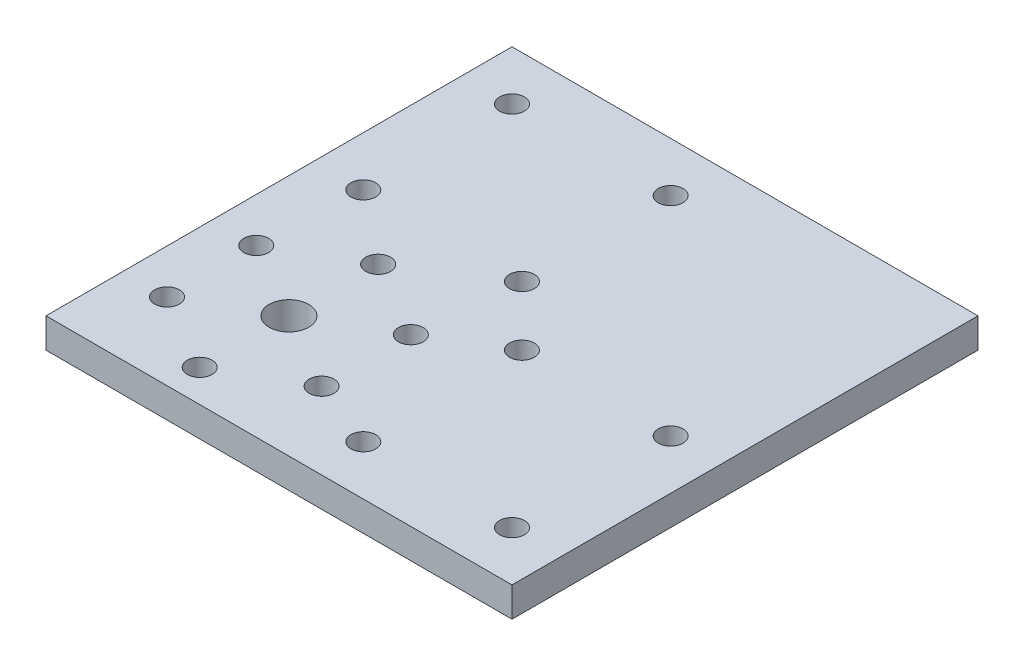
ISO-10303-21;
HEADER;
FILE_DESCRIPTION(('STEP AP214'),'2;1');
FILE_NAME('part.step','',(''),(''),'','','');
FILE_SCHEMA(('AUTOMOTIVE_DESIGN { 1 0 10303 214 1 1 1 1 }'));
ENDSEC;
DATA;
#1=APPLICATION_CONTEXT('core data for automotive mechanical design processes');
#2=APPLICATION_PROTOCOL_DEFINITION('international standard','automotive_design',2000,#1);
#3=PRODUCT_CONTEXT('',#1,'mechanical');
#4=PRODUCT('Part','Part','',(#3));
#5=PRODUCT_RELATED_PRODUCT_CATEGORY('part','',(#4));
#6=PRODUCT_DEFINITION_FORMATION('','',#4);
#7=PRODUCT_DEFINITION_CONTEXT('part definition',#1,'design');
#8=PRODUCT_DEFINITION('design','',#6,#7);
#9=PRODUCT_DEFINITION_SHAPE('','',#8);
#10=(LENGTH_UNIT() NAMED_UNIT(*) SI_UNIT(.MILLI.,.METRE.));
#11=(NAMED_UNIT(*) PLANE_ANGLE_UNIT() SI_UNIT($,.RADIAN.));
#12=(NAMED_UNIT(*) SI_UNIT($,.STERADIAN.) SOLID_ANGLE_UNIT());
#13=UNCERTAINTY_MEASURE_WITH_UNIT(LENGTH_MEASURE(1.E-05),#10,'distance_accuracy_value','');
#14=(GEOMETRIC_REPRESENTATION_CONTEXT(3) GLOBAL_UNCERTAINTY_ASSIGNED_CONTEXT((#13)) GLOBAL_UNIT_ASSIGNED_CONTEXT((#10,
#11,#12)) REPRESENTATION_CONTEXT('',''));
#15=CARTESIAN_POINT('',(0.,0.,0.));
#16=DIRECTION('',(0.,0.,1.));
#17=DIRECTION('',(1.,0.,0.));
#18=AXIS2_PLACEMENT_3D('',#15,#16,#17);
#19=CARTESIAN_POINT('',(-13.,3.,34.5));
#20=DIRECTION('',(1.,0.,0.));
#21=DIRECTION('',(0.,0.,-1.));
#22=AXIS2_PLACEMENT_3D('',#19,#20,#21);
#23=PLANE('',#22);
#24=DIRECTION('',(0.,0.,1.));
#25=VECTOR('',#24,1.);
#26=CARTESIAN_POINT('',(-13.,0.,34.5));
#27=LINE('',#26,#25);
#28=CARTESIAN_POINT('',(-13.,0.,-12.5));
#29=VERTEX_POINT('',#28);
#30=CARTESIAN_POINT('',(-13.,0.,34.5));
#31=VERTEX_POINT('',#30);
#32=EDGE_CURVE('E107',#29,#31,#27,.T.);
#33=ORIENTED_EDGE('',*,*,#32,.T.);
#34=DIRECTION('',(0.,-1.,0.));
#35=VECTOR('',#34,1.);
#36=CARTESIAN_POINT('',(-13.,3.,34.5));
#37=LINE('',#36,#35);
#38=CARTESIAN_POINT('',(-13.,3.,34.5));
#39=VERTEX_POINT('',#38);
#40=EDGE_CURVE('E11',#39,#31,#37,.T.);
#41=ORIENTED_EDGE('',*,*,#40,.F.);
#42=DIRECTION('',(0.,0.,1.));
#43=VECTOR('',#42,1.);
#44=CARTESIAN_POINT('',(-13.,3.,34.5));
#45=LINE('',#44,#43);
#46=CARTESIAN_POINT('',(-13.,3.,-12.5));
#47=VERTEX_POINT('',#46);
#48=EDGE_CURVE('E91',#47,#39,#45,.T.);
#49=ORIENTED_EDGE('',*,*,#48,.F.);
#50=DIRECTION('',(0.,-1.,0.));
#51=VECTOR('',#50,1.);
#52=CARTESIAN_POINT('',(-13.,3.,-12.5));
#53=LINE('',#52,#51);
#54=EDGE_CURVE('E103',#47,#29,#53,.T.);
#55=ORIENTED_EDGE('',*,*,#54,.T.);
#56=EDGE_LOOP('',(#33,#41,#49,#55));
#57=FACE_BOUND('',#56,.T.);
#58=ADVANCED_FACE('F39',(#57),#23,.F.);
#59=CARTESIAN_POINT('',(34.,3.,34.5));
#60=DIRECTION('',(0.,0.,-1.));
#61=DIRECTION('',(-1.,0.,0.));
#62=AXIS2_PLACEMENT_3D('',#59,#60,#61);
#63=PLANE('',#62);
#64=DIRECTION('',(1.,0.,0.));
#65=VECTOR('',#64,1.);
#66=CARTESIAN_POINT('',(34.,0.,34.5));
#67=LINE('',#66,#65);
#68=CARTESIAN_POINT('',(34.,0.,34.5));
#69=VERTEX_POINT('',#68);
#70=EDGE_CURVE('E96',#31,#69,#67,.T.);
#71=ORIENTED_EDGE('',*,*,#70,.T.);
#72=DIRECTION('',(0.,-1.,0.));
#73=VECTOR('',#72,1.);
#74=CARTESIAN_POINT('',(34.,3.,34.5));
#75=LINE('',#74,#73);
#76=CARTESIAN_POINT('',(34.,3.,34.5));
#77=VERTEX_POINT('',#76);
#78=EDGE_CURVE('E48',#77,#69,#75,.T.);
#79=ORIENTED_EDGE('',*,*,#78,.F.);
#80=DIRECTION('',(1.,0.,0.));
#81=VECTOR('',#80,1.);
#82=CARTESIAN_POINT('',(34.,3.,34.5));
#83=LINE('',#82,#81);
#84=EDGE_CURVE('E86',#39,#77,#83,.T.);
#85=ORIENTED_EDGE('',*,*,#84,.F.);
#86=ORIENTED_EDGE('',*,*,#40,.T.);
#87=EDGE_LOOP('',(#71,#79,#85,#86));
#88=FACE_BOUND('',#87,.T.);
#89=ADVANCED_FACE('F95',(#88),#63,.F.);
#90=CARTESIAN_POINT('',(34.,3.,-12.5));
#91=DIRECTION('',(-1.,0.,0.));
#92=DIRECTION('',(0.,0.,1.));
#93=AXIS2_PLACEMENT_3D('',#90,#91,#92);
#94=PLANE('',#93);
#95=DIRECTION('',(0.,0.,-1.));
#96=VECTOR('',#95,1.);
#97=CARTESIAN_POINT('',(34.,0.,-12.5));
#98=LINE('',#97,#96);
#99=CARTESIAN_POINT('',(34.,0.,-12.5));
#100=VERTEX_POINT('',#99);
#101=EDGE_CURVE('E73',#69,#100,#98,.T.);
#102=ORIENTED_EDGE('',*,*,#101,.T.);
#103=DIRECTION('',(0.,-1.,0.));
#104=VECTOR('',#103,1.);
#105=CARTESIAN_POINT('',(34.,3.,-12.5));
#106=LINE('',#105,#104);
#107=CARTESIAN_POINT('',(34.,3.,-12.5));
#108=VERTEX_POINT('',#107);
#109=EDGE_CURVE('E98',#108,#100,#106,.T.);
#110=ORIENTED_EDGE('',*,*,#109,.F.);
#111=DIRECTION('',(0.,0.,-1.));
#112=VECTOR('',#111,1.);
#113=CARTESIAN_POINT('',(34.,3.,-12.5));
#114=LINE('',#113,#112);
#115=EDGE_CURVE('E89',#77,#108,#114,.T.);
#116=ORIENTED_EDGE('',*,*,#115,.F.);
#117=ORIENTED_EDGE('',*,*,#78,.T.);
#118=EDGE_LOOP('',(#102,#110,#116,#117));
#119=FACE_BOUND('',#118,.T.);
#120=ADVANCED_FACE('F99',(#119),#94,.F.);
#121=CARTESIAN_POINT('',(-13.,3.,-12.5));
#122=DIRECTION('',(0.,0.,1.));
#123=DIRECTION('',(1.,0.,0.));
#124=AXIS2_PLACEMENT_3D('',#121,#122,#123);
#125=PLANE('',#124);
#126=DIRECTION('',(-1.,0.,0.));
#127=VECTOR('',#126,1.);
#128=CARTESIAN_POINT('',(-13.,0.,-12.5));
#129=LINE('',#128,#127);
#130=EDGE_CURVE('E79',#100,#29,#129,.T.);
#131=ORIENTED_EDGE('',*,*,#130,.T.);
#132=ORIENTED_EDGE('',*,*,#54,.F.);
#133=DIRECTION('',(-1.,0.,0.));
#134=VECTOR('',#133,1.);
#135=CARTESIAN_POINT('',(-13.,3.,-12.5));
#136=LINE('',#135,#134);
#137=EDGE_CURVE('E56',#108,#47,#136,.T.);
#138=ORIENTED_EDGE('',*,*,#137,.F.);
#139=ORIENTED_EDGE('',*,*,#109,.T.);
#140=EDGE_LOOP('',(#131,#132,#138,#139));
#141=FACE_BOUND('',#140,.T.);
#142=ADVANCED_FACE('F121',(#141),#125,.F.);
#143=CARTESIAN_POINT('',(0.,3.,0.));
#144=DIRECTION('',(0.,-1.,0.));
#145=DIRECTION('',(0.,0.,-1.));
#146=AXIS2_PLACEMENT_3D('',#143,#144,#145);
#147=PLANE('',#146);
#148=CARTESIAN_POINT('',(-0.749999999999989,3.,22.25));
#149=DIRECTION('',(0.,1.,0.));
#150=DIRECTION('',(0.,0.,1.));
#151=AXIS2_PLACEMENT_3D('',#148,#149,#150);
#152=CIRCLE('',#151,2.);
#153=CARTESIAN_POINT('',(-0.749999999999989,3.,24.25));
#154=VERTEX_POINT('',#153);
#155=EDGE_CURVE('E243',#154,#154,#152,.T.);
#156=ORIENTED_EDGE('',*,*,#155,.F.);
#157=EDGE_LOOP('',(#156));
#158=FACE_BOUND('',#157,.T.);
#159=CARTESIAN_POINT('',(-0.749999999999988,3.,13.25));
#160=DIRECTION('',(0.,1.,0.));
#161=DIRECTION('',(0.,0.,1.));
#162=AXIS2_PLACEMENT_3D('',#159,#160,#161);
#163=CIRCLE('',#162,1.24999999999999);
#164=CARTESIAN_POINT('',(-0.749999999999988,3.,14.5));
#165=VERTEX_POINT('',#164);
#166=EDGE_CURVE('E235',#165,#165,#163,.T.);
#167=ORIENTED_EDGE('',*,*,#166,.F.);
#168=EDGE_LOOP('',(#167));
#169=FACE_BOUND('',#168,.T.);
#170=CARTESIAN_POINT('',(-8.54422863405994,3.,17.75));
#171=DIRECTION('',(0.,1.,0.));
#172=DIRECTION('',(0.,0.,1.));
#173=AXIS2_PLACEMENT_3D('',#170,#171,#172);
#174=CIRCLE('',#173,1.24999999999999);
#175=CARTESIAN_POINT('',(-8.54422863405994,3.,19.));
#176=VERTEX_POINT('',#175);
#177=EDGE_CURVE('E227',#176,#176,#174,.T.);
#178=ORIENTED_EDGE('',*,*,#177,.F.);
#179=EDGE_LOOP('',(#178));
#180=FACE_BOUND('',#179,.T.);
#181=CARTESIAN_POINT('',(-8.54422863405993,3.,26.75));
#182=DIRECTION('',(0.,1.,0.));
#183=DIRECTION('',(0.,0.,1.));
#184=AXIS2_PLACEMENT_3D('',#181,#182,#183);
#185=CIRCLE('',#184,1.24999999999999);
#186=CARTESIAN_POINT('',(-8.54422863405993,3.,28.));
#187=VERTEX_POINT('',#186);
#188=EDGE_CURVE('E219',#187,#187,#185,.T.);
#189=ORIENTED_EDGE('',*,*,#188,.F.);
#190=EDGE_LOOP('',(#189));
#191=FACE_BOUND('',#190,.T.);
#192=CARTESIAN_POINT('',(-0.749999999999987,3.,31.25));
#193=DIRECTION('',(0.,1.,0.));
#194=DIRECTION('',(0.,0.,1.));
#195=AXIS2_PLACEMENT_3D('',#192,#193,#194);
#196=CIRCLE('',#195,1.24999999999999);
#197=CARTESIAN_POINT('',(-0.749999999999987,3.,32.5));
#198=VERTEX_POINT('',#197);
#199=EDGE_CURVE('E211',#198,#198,#196,.T.);
#200=ORIENTED_EDGE('',*,*,#199,.F.);
#201=EDGE_LOOP('',(#200));
#202=FACE_BOUND('',#201,.T.);
#203=CARTESIAN_POINT('',(7.04422863405996,3.,26.75));
#204=DIRECTION('',(0.,1.,0.));
#205=DIRECTION('',(0.,0.,1.));
#206=AXIS2_PLACEMENT_3D('',#203,#204,#205);
#207=CIRCLE('',#206,1.24999999999999);
#208=CARTESIAN_POINT('',(7.04422863405996,3.,28.));
#209=VERTEX_POINT('',#208);
#210=EDGE_CURVE('E203',#209,#209,#207,.T.);
#211=ORIENTED_EDGE('',*,*,#210,.F.);
#212=EDGE_LOOP('',(#211));
#213=FACE_BOUND('',#212,.T.);
#214=CARTESIAN_POINT('',(7.04422863405996,3.,17.75));
#215=DIRECTION('',(0.,1.,0.));
#216=DIRECTION('',(0.,0.,1.));
#217=AXIS2_PLACEMENT_3D('',#214,#215,#216);
#218=CIRCLE('',#217,1.24999999999999);
#219=CARTESIAN_POINT('',(7.04422863405996,3.,19.));
#220=VERTEX_POINT('',#219);
#221=EDGE_CURVE('E195',#220,#220,#218,.T.);
#222=ORIENTED_EDGE('',*,*,#221,.F.);
#223=EDGE_LOOP('',(#222));
#224=FACE_BOUND('',#223,.T.);
#225=CARTESIAN_POINT('',(-8.,3.,-7.5));
#226=DIRECTION('',(0.,1.,0.));
#227=DIRECTION('',(0.,0.,1.));
#228=AXIS2_PLACEMENT_3D('',#225,#226,#227);
#229=CIRCLE('',#228,1.24999999999999);
#230=CARTESIAN_POINT('',(-8.,3.,-6.25000000000001));
#231=VERTEX_POINT('',#230);
#232=EDGE_CURVE('E187',#231,#231,#229,.T.);
#233=ORIENTED_EDGE('',*,*,#232,.F.);
#234=EDGE_LOOP('',(#233));
#235=FACE_BOUND('',#234,.T.);
#236=CARTESIAN_POINT('',(8.,3.,-7.5));
#237=DIRECTION('',(0.,1.,0.));
#238=DIRECTION('',(0.,0.,1.));
#239=AXIS2_PLACEMENT_3D('',#236,#237,#238);
#240=CIRCLE('',#239,1.24999999999999);
#241=CARTESIAN_POINT('',(8.,3.,-6.25000000000001));
#242=VERTEX_POINT('',#241);
#243=EDGE_CURVE('E179',#242,#242,#240,.T.);
#244=ORIENTED_EDGE('',*,*,#243,.F.);
#245=EDGE_LOOP('',(#244));
#246=FACE_BOUND('',#245,.T.);
#247=CARTESIAN_POINT('',(8.,3.,7.5));
#248=DIRECTION('',(0.,1.,0.));
#249=DIRECTION('',(0.,0.,1.));
#250=AXIS2_PLACEMENT_3D('',#247,#248,#249);
#251=CIRCLE('',#250,1.24999999999999);
#252=CARTESIAN_POINT('',(8.,3.,8.74999999999999));
#253=VERTEX_POINT('',#252);
#254=EDGE_CURVE('E171',#253,#253,#251,.T.);
#255=ORIENTED_EDGE('',*,*,#254,.F.);
#256=EDGE_LOOP('',(#255));
#257=FACE_BOUND('',#256,.T.);
#258=CARTESIAN_POINT('',(-8.,3.,7.5));
#259=DIRECTION('',(0.,1.,0.));
#260=DIRECTION('',(0.,0.,1.));
#261=AXIS2_PLACEMENT_3D('',#258,#259,#260);
#262=CIRCLE('',#261,1.24999999999999);
#263=CARTESIAN_POINT('',(-8.,3.,8.74999999999999));
#264=VERTEX_POINT('',#263);
#265=EDGE_CURVE('E163',#264,#264,#262,.T.);
#266=ORIENTED_EDGE('',*,*,#265,.F.);
#267=EDGE_LOOP('',(#266));
#268=FACE_BOUND('',#267,.T.);
#269=CARTESIAN_POINT('',(14.,3.,13.5));
#270=DIRECTION('',(0.,1.,0.));
#271=DIRECTION('',(0.,0.,1.));
#272=AXIS2_PLACEMENT_3D('',#269,#270,#271);
#273=CIRCLE('',#272,1.24999999999999);
#274=CARTESIAN_POINT('',(14.,3.,14.75));
#275=VERTEX_POINT('',#274);
#276=EDGE_CURVE('E155',#275,#275,#273,.T.);
#277=ORIENTED_EDGE('',*,*,#276,.F.);
#278=EDGE_LOOP('',(#277));
#279=FACE_BOUND('',#278,.T.);
#280=CARTESIAN_POINT('',(29.,3.,13.5));
#281=DIRECTION('',(0.,1.,0.));
#282=DIRECTION('',(0.,0.,1.));
#283=AXIS2_PLACEMENT_3D('',#280,#281,#282);
#284=CIRCLE('',#283,1.24999999999999);
#285=CARTESIAN_POINT('',(29.,3.,14.75));
#286=VERTEX_POINT('',#285);
#287=EDGE_CURVE('E147',#286,#286,#284,.T.);
#288=ORIENTED_EDGE('',*,*,#287,.F.);
#289=EDGE_LOOP('',(#288));
#290=FACE_BOUND('',#289,.T.);
#291=CARTESIAN_POINT('',(29.,3.,29.5));
#292=DIRECTION('',(0.,1.,0.));
#293=DIRECTION('',(0.,0.,1.));
#294=AXIS2_PLACEMENT_3D('',#291,#292,#293);
#295=CIRCLE('',#294,1.24999999999999);
#296=CARTESIAN_POINT('',(29.,3.,30.75));
#297=VERTEX_POINT('',#296);
#298=EDGE_CURVE('E139',#297,#297,#295,.T.);
#299=ORIENTED_EDGE('',*,*,#298,.F.);
#300=EDGE_LOOP('',(#299));
#301=FACE_BOUND('',#300,.T.);
#302=CARTESIAN_POINT('',(14.,3.,29.5));
#303=DIRECTION('',(0.,1.,0.));
#304=DIRECTION('',(0.,0.,1.));
#305=AXIS2_PLACEMENT_3D('',#302,#303,#304);
#306=CIRCLE('',#305,1.24999999999999);
#307=CARTESIAN_POINT('',(14.,3.,30.75));
#308=VERTEX_POINT('',#307);
#309=EDGE_CURVE('E131',#308,#308,#306,.T.);
#310=ORIENTED_EDGE('',*,*,#309,.F.);
#311=EDGE_LOOP('',(#310));
#312=FACE_BOUND('',#311,.T.);
#313=ORIENTED_EDGE('',*,*,#48,.T.);
#314=ORIENTED_EDGE('',*,*,#84,.T.);
#315=ORIENTED_EDGE('',*,*,#115,.T.);
#316=ORIENTED_EDGE('',*,*,#137,.T.);
#317=EDGE_LOOP('',(#313,#314,#315,#316));
#318=FACE_BOUND('',#317,.T.);
#319=ADVANCED_FACE('F87',(#158,#169,#180,#191,#202,#213,#224,#235,#246,#257,#268,#279,#290,#301,
#312,#318),#147,.F.);
#320=CARTESIAN_POINT('',(0.,0.,0.));
#321=DIRECTION('',(0.,-1.,0.));
#322=DIRECTION('',(0.,0.,-1.));
#323=AXIS2_PLACEMENT_3D('',#320,#321,#322);
#324=PLANE('',#323);
#325=CARTESIAN_POINT('',(-0.749999999999989,0.,22.25));
#326=DIRECTION('',(0.,1.,0.));
#327=DIRECTION('',(0.,0.,1.));
#328=AXIS2_PLACEMENT_3D('',#325,#326,#327);
#329=CIRCLE('',#328,2.);
#330=CARTESIAN_POINT('',(-0.749999999999989,0.,24.25));
#331=VERTEX_POINT('',#330);
#332=EDGE_CURVE('E239',#331,#331,#329,.T.);
#333=ORIENTED_EDGE('',*,*,#332,.T.);
#334=EDGE_LOOP('',(#333));
#335=FACE_BOUND('',#334,.T.);
#336=CARTESIAN_POINT('',(-0.749999999999988,0.,13.25));
#337=DIRECTION('',(0.,1.,0.));
#338=DIRECTION('',(0.,0.,1.));
#339=AXIS2_PLACEMENT_3D('',#336,#337,#338);
#340=CIRCLE('',#339,1.25);
#341=CARTESIAN_POINT('',(-0.749999999999988,0.,14.5));
#342=VERTEX_POINT('',#341);
#343=EDGE_CURVE('E231',#342,#342,#340,.T.);
#344=ORIENTED_EDGE('',*,*,#343,.T.);
#345=EDGE_LOOP('',(#344));
#346=FACE_BOUND('',#345,.T.);
#347=CARTESIAN_POINT('',(-8.54422863405994,0.,17.75));
#348=DIRECTION('',(0.,1.,0.));
#349=DIRECTION('',(0.,0.,1.));
#350=AXIS2_PLACEMENT_3D('',#347,#348,#349);
#351=CIRCLE('',#350,1.25);
#352=CARTESIAN_POINT('',(-8.54422863405994,0.,19.));
#353=VERTEX_POINT('',#352);
#354=EDGE_CURVE('E223',#353,#353,#351,.T.);
#355=ORIENTED_EDGE('',*,*,#354,.T.);
#356=EDGE_LOOP('',(#355));
#357=FACE_BOUND('',#356,.T.);
#358=CARTESIAN_POINT('',(-8.54422863405993,0.,26.75));
#359=DIRECTION('',(0.,1.,0.));
#360=DIRECTION('',(0.,0.,1.));
#361=AXIS2_PLACEMENT_3D('',#358,#359,#360);
#362=CIRCLE('',#361,1.25);
#363=CARTESIAN_POINT('',(-8.54422863405993,0.,28.));
#364=VERTEX_POINT('',#363);
#365=EDGE_CURVE('E215',#364,#364,#362,.T.);
#366=ORIENTED_EDGE('',*,*,#365,.T.);
#367=EDGE_LOOP('',(#366));
#368=FACE_BOUND('',#367,.T.);
#369=CARTESIAN_POINT('',(-0.749999999999987,0.,31.25));
#370=DIRECTION('',(0.,1.,0.));
#371=DIRECTION('',(0.,0.,1.));
#372=AXIS2_PLACEMENT_3D('',#369,#370,#371);
#373=CIRCLE('',#372,1.25);
#374=CARTESIAN_POINT('',(-0.749999999999987,0.,32.5));
#375=VERTEX_POINT('',#374);
#376=EDGE_CURVE('E207',#375,#375,#373,.T.);
#377=ORIENTED_EDGE('',*,*,#376,.T.);
#378=EDGE_LOOP('',(#377));
#379=FACE_BOUND('',#378,.T.);
#380=CARTESIAN_POINT('',(7.04422863405996,0.,26.75));
#381=DIRECTION('',(0.,1.,0.));
#382=DIRECTION('',(0.,0.,1.));
#383=AXIS2_PLACEMENT_3D('',#380,#381,#382);
#384=CIRCLE('',#383,1.25);
#385=CARTESIAN_POINT('',(7.04422863405996,0.,28.));
#386=VERTEX_POINT('',#385);
#387=EDGE_CURVE('E199',#386,#386,#384,.T.);
#388=ORIENTED_EDGE('',*,*,#387,.T.);
#389=EDGE_LOOP('',(#388));
#390=FACE_BOUND('',#389,.T.);
#391=CARTESIAN_POINT('',(7.04422863405996,0.,17.75));
#392=DIRECTION('',(0.,1.,0.));
#393=DIRECTION('',(0.,0.,1.));
#394=AXIS2_PLACEMENT_3D('',#391,#392,#393);
#395=CIRCLE('',#394,1.25);
#396=CARTESIAN_POINT('',(7.04422863405996,0.,19.));
#397=VERTEX_POINT('',#396);
#398=EDGE_CURVE('E191',#397,#397,#395,.T.);
#399=ORIENTED_EDGE('',*,*,#398,.T.);
#400=EDGE_LOOP('',(#399));
#401=FACE_BOUND('',#400,.T.);
#402=CARTESIAN_POINT('',(-8.,0.,-7.5));
#403=DIRECTION('',(0.,1.,0.));
#404=DIRECTION('',(0.,0.,1.));
#405=AXIS2_PLACEMENT_3D('',#402,#403,#404);
#406=CIRCLE('',#405,1.25);
#407=CARTESIAN_POINT('',(-8.,0.,-6.25));
#408=VERTEX_POINT('',#407);
#409=EDGE_CURVE('E183',#408,#408,#406,.T.);
#410=ORIENTED_EDGE('',*,*,#409,.T.);
#411=EDGE_LOOP('',(#410));
#412=FACE_BOUND('',#411,.T.);
#413=CARTESIAN_POINT('',(8.,0.,-7.5));
#414=DIRECTION('',(0.,1.,0.));
#415=DIRECTION('',(0.,0.,1.));
#416=AXIS2_PLACEMENT_3D('',#413,#414,#415);
#417=CIRCLE('',#416,1.25);
#418=CARTESIAN_POINT('',(8.,0.,-6.25));
#419=VERTEX_POINT('',#418);
#420=EDGE_CURVE('E175',#419,#419,#417,.T.);
#421=ORIENTED_EDGE('',*,*,#420,.T.);
#422=EDGE_LOOP('',(#421));
#423=FACE_BOUND('',#422,.T.);
#424=CARTESIAN_POINT('',(8.,0.,7.5));
#425=DIRECTION('',(0.,1.,0.));
#426=DIRECTION('',(0.,0.,1.));
#427=AXIS2_PLACEMENT_3D('',#424,#425,#426);
#428=CIRCLE('',#427,1.25);
#429=CARTESIAN_POINT('',(8.,0.,8.75));
#430=VERTEX_POINT('',#429);
#431=EDGE_CURVE('E167',#430,#430,#428,.T.);
#432=ORIENTED_EDGE('',*,*,#431,.T.);
#433=EDGE_LOOP('',(#432));
#434=FACE_BOUND('',#433,.T.);
#435=CARTESIAN_POINT('',(-8.,0.,7.5));
#436=DIRECTION('',(0.,1.,0.));
#437=DIRECTION('',(0.,0.,1.));
#438=AXIS2_PLACEMENT_3D('',#435,#436,#437);
#439=CIRCLE('',#438,1.25);
#440=CARTESIAN_POINT('',(-8.,0.,8.75));
#441=VERTEX_POINT('',#440);
#442=EDGE_CURVE('E159',#441,#441,#439,.T.);
#443=ORIENTED_EDGE('',*,*,#442,.T.);
#444=EDGE_LOOP('',(#443));
#445=FACE_BOUND('',#444,.T.);
#446=CARTESIAN_POINT('',(14.,0.,13.5));
#447=DIRECTION('',(0.,1.,0.));
#448=DIRECTION('',(0.,0.,1.));
#449=AXIS2_PLACEMENT_3D('',#446,#447,#448);
#450=CIRCLE('',#449,1.25);
#451=CARTESIAN_POINT('',(14.,0.,14.75));
#452=VERTEX_POINT('',#451);
#453=EDGE_CURVE('E151',#452,#452,#450,.T.);
#454=ORIENTED_EDGE('',*,*,#453,.T.);
#455=EDGE_LOOP('',(#454));
#456=FACE_BOUND('',#455,.T.);
#457=CARTESIAN_POINT('',(29.,0.,13.5));
#458=DIRECTION('',(0.,1.,0.));
#459=DIRECTION('',(0.,0.,1.));
#460=AXIS2_PLACEMENT_3D('',#457,#458,#459);
#461=CIRCLE('',#460,1.25);
#462=CARTESIAN_POINT('',(29.,0.,14.75));
#463=VERTEX_POINT('',#462);
#464=EDGE_CURVE('E143',#463,#463,#461,.T.);
#465=ORIENTED_EDGE('',*,*,#464,.T.);
#466=EDGE_LOOP('',(#465));
#467=FACE_BOUND('',#466,.T.);
#468=CARTESIAN_POINT('',(29.,0.,29.5));
#469=DIRECTION('',(0.,1.,0.));
#470=DIRECTION('',(0.,0.,1.));
#471=AXIS2_PLACEMENT_3D('',#468,#469,#470);
#472=CIRCLE('',#471,1.25);
#473=CARTESIAN_POINT('',(29.,0.,30.75));
#474=VERTEX_POINT('',#473);
#475=EDGE_CURVE('E135',#474,#474,#472,.T.);
#476=ORIENTED_EDGE('',*,*,#475,.T.);
#477=EDGE_LOOP('',(#476));
#478=FACE_BOUND('',#477,.T.);
#479=CARTESIAN_POINT('',(14.,0.,29.5));
#480=DIRECTION('',(0.,1.,0.));
#481=DIRECTION('',(0.,0.,1.));
#482=AXIS2_PLACEMENT_3D('',#479,#480,#481);
#483=CIRCLE('',#482,1.25);
#484=CARTESIAN_POINT('',(14.,0.,30.75));
#485=VERTEX_POINT('',#484);
#486=EDGE_CURVE('E111',#485,#485,#483,.T.);
#487=ORIENTED_EDGE('',*,*,#486,.T.);
#488=EDGE_LOOP('',(#487));
#489=FACE_BOUND('',#488,.T.);
#490=ORIENTED_EDGE('',*,*,#32,.F.);
#491=ORIENTED_EDGE('',*,*,#130,.F.);
#492=ORIENTED_EDGE('',*,*,#101,.F.);
#493=ORIENTED_EDGE('',*,*,#70,.F.);
#494=EDGE_LOOP('',(#490,#491,#492,#493));
#495=FACE_BOUND('',#494,.T.);
#496=ADVANCED_FACE('F124',(#335,#346,#357,#368,#379,#390,#401,#412,#423,#434,#445,#456,#467,
#478,#489,#495),#324,.T.);
#497=CARTESIAN_POINT('',(14.,3.,29.5));
#498=DIRECTION('',(0.,1.,0.));
#499=DIRECTION('',(0.,0.,1.));
#500=AXIS2_PLACEMENT_3D('',#497,#498,#499);
#501=CYLINDRICAL_SURFACE('',#500,1.24999999999999);
#502=ORIENTED_EDGE('',*,*,#486,.F.);
#503=EDGE_LOOP('',(#502));
#504=FACE_BOUND('',#503,.T.);
#505=ORIENTED_EDGE('',*,*,#309,.T.);
#506=EDGE_LOOP('',(#505));
#507=FACE_BOUND('',#506,.T.);
#508=ADVANCED_FACE('F281',(#504,#507),#501,.F.);
#509=CARTESIAN_POINT('',(29.,3.,29.5));
#510=DIRECTION('',(0.,1.,0.));
#511=DIRECTION('',(0.,0.,1.));
#512=AXIS2_PLACEMENT_3D('',#509,#510,#511);
#513=CYLINDRICAL_SURFACE('',#512,1.24999999999999);
#514=ORIENTED_EDGE('',*,*,#475,.F.);
#515=EDGE_LOOP('',(#514));
#516=FACE_BOUND('',#515,.T.);
#517=ORIENTED_EDGE('',*,*,#298,.T.);
#518=EDGE_LOOP('',(#517));
#519=FACE_BOUND('',#518,.T.);
#520=ADVANCED_FACE('F283',(#516,#519),#513,.F.);
#521=CARTESIAN_POINT('',(29.,3.,13.5));
#522=DIRECTION('',(0.,1.,0.));
#523=DIRECTION('',(0.,0.,1.));
#524=AXIS2_PLACEMENT_3D('',#521,#522,#523);
#525=CYLINDRICAL_SURFACE('',#524,1.24999999999999);
#526=ORIENTED_EDGE('',*,*,#464,.F.);
#527=EDGE_LOOP('',(#526));
#528=FACE_BOUND('',#527,.T.);
#529=ORIENTED_EDGE('',*,*,#287,.T.);
#530=EDGE_LOOP('',(#529));
#531=FACE_BOUND('',#530,.T.);
#532=ADVANCED_FACE('F290',(#528,#531),#525,.F.);
#533=CARTESIAN_POINT('',(14.,3.,13.5));
#534=DIRECTION('',(0.,1.,0.));
#535=DIRECTION('',(0.,0.,1.));
#536=AXIS2_PLACEMENT_3D('',#533,#534,#535);
#537=CYLINDRICAL_SURFACE('',#536,1.24999999999999);
#538=ORIENTED_EDGE('',*,*,#453,.F.);
#539=EDGE_LOOP('',(#538));
#540=FACE_BOUND('',#539,.T.);
#541=ORIENTED_EDGE('',*,*,#276,.T.);
#542=EDGE_LOOP('',(#541));
#543=FACE_BOUND('',#542,.T.);
#544=ADVANCED_FACE('F409',(#540,#543),#537,.F.);
#545=CARTESIAN_POINT('',(-8.,3.,7.5));
#546=DIRECTION('',(0.,1.,0.));
#547=DIRECTION('',(0.,0.,1.));
#548=AXIS2_PLACEMENT_3D('',#545,#546,#547);
#549=CYLINDRICAL_SURFACE('',#548,1.24999999999999);
#550=ORIENTED_EDGE('',*,*,#442,.F.);
#551=EDGE_LOOP('',(#550));
#552=FACE_BOUND('',#551,.T.);
#553=ORIENTED_EDGE('',*,*,#265,.T.);
#554=EDGE_LOOP('',(#553));
#555=FACE_BOUND('',#554,.T.);
#556=ADVANCED_FACE('F401',(#552,#555),#549,.F.);
#557=CARTESIAN_POINT('',(8.,3.,7.5));
#558=DIRECTION('',(0.,1.,0.));
#559=DIRECTION('',(0.,0.,1.));
#560=AXIS2_PLACEMENT_3D('',#557,#558,#559);
#561=CYLINDRICAL_SURFACE('',#560,1.24999999999999);
#562=ORIENTED_EDGE('',*,*,#431,.F.);
#563=EDGE_LOOP('',(#562));
#564=FACE_BOUND('',#563,.T.);
#565=ORIENTED_EDGE('',*,*,#254,.T.);
#566=EDGE_LOOP('',(#565));
#567=FACE_BOUND('',#566,.T.);
#568=ADVANCED_FACE('F393',(#564,#567),#561,.F.);
#569=CARTESIAN_POINT('',(8.,3.,-7.5));
#570=DIRECTION('',(0.,1.,0.));
#571=DIRECTION('',(0.,0.,1.));
#572=AXIS2_PLACEMENT_3D('',#569,#570,#571);
#573=CYLINDRICAL_SURFACE('',#572,1.24999999999999);
#574=ORIENTED_EDGE('',*,*,#420,.F.);
#575=EDGE_LOOP('',(#574));
#576=FACE_BOUND('',#575,.T.);
#577=ORIENTED_EDGE('',*,*,#243,.T.);
#578=EDGE_LOOP('',(#577));
#579=FACE_BOUND('',#578,.T.);
#580=ADVANCED_FACE('F385',(#576,#579),#573,.F.);
#581=CARTESIAN_POINT('',(-8.,3.,-7.5));
#582=DIRECTION('',(0.,1.,0.));
#583=DIRECTION('',(0.,0.,1.));
#584=AXIS2_PLACEMENT_3D('',#581,#582,#583);
#585=CYLINDRICAL_SURFACE('',#584,1.24999999999999);
#586=ORIENTED_EDGE('',*,*,#409,.F.);
#587=EDGE_LOOP('',(#586));
#588=FACE_BOUND('',#587,.T.);
#589=ORIENTED_EDGE('',*,*,#232,.T.);
#590=EDGE_LOOP('',(#589));
#591=FACE_BOUND('',#590,.T.);
#592=ADVANCED_FACE('F377',(#588,#591),#585,.F.);
#593=CARTESIAN_POINT('',(7.04422863405996,3.,17.75));
#594=DIRECTION('',(0.,1.,0.));
#595=DIRECTION('',(0.,0.,1.));
#596=AXIS2_PLACEMENT_3D('',#593,#594,#595);
#597=CYLINDRICAL_SURFACE('',#596,1.24999999999999);
#598=ORIENTED_EDGE('',*,*,#398,.F.);
#599=EDGE_LOOP('',(#598));
#600=FACE_BOUND('',#599,.T.);
#601=ORIENTED_EDGE('',*,*,#221,.T.);
#602=EDGE_LOOP('',(#601));
#603=FACE_BOUND('',#602,.T.);
#604=ADVANCED_FACE('F369',(#600,#603),#597,.F.);
#605=CARTESIAN_POINT('',(7.04422863405996,3.,26.75));
#606=DIRECTION('',(0.,1.,0.));
#607=DIRECTION('',(0.,0.,1.));
#608=AXIS2_PLACEMENT_3D('',#605,#606,#607);
#609=CYLINDRICAL_SURFACE('',#608,1.24999999999999);
#610=ORIENTED_EDGE('',*,*,#387,.F.);
#611=EDGE_LOOP('',(#610));
#612=FACE_BOUND('',#611,.T.);
#613=ORIENTED_EDGE('',*,*,#210,.T.);
#614=EDGE_LOOP('',(#613));
#615=FACE_BOUND('',#614,.T.);
#616=ADVANCED_FACE('F361',(#612,#615),#609,.F.);
#617=CARTESIAN_POINT('',(-0.749999999999987,3.,31.25));
#618=DIRECTION('',(0.,1.,0.));
#619=DIRECTION('',(0.,0.,1.));
#620=AXIS2_PLACEMENT_3D('',#617,#618,#619);
#621=CYLINDRICAL_SURFACE('',#620,1.24999999999999);
#622=ORIENTED_EDGE('',*,*,#376,.F.);
#623=EDGE_LOOP('',(#622));
#624=FACE_BOUND('',#623,.T.);
#625=ORIENTED_EDGE('',*,*,#199,.T.);
#626=EDGE_LOOP('',(#625));
#627=FACE_BOUND('',#626,.T.);
#628=ADVANCED_FACE('F353',(#624,#627),#621,.F.);
#629=CARTESIAN_POINT('',(-8.54422863405993,3.,26.75));
#630=DIRECTION('',(0.,1.,0.));
#631=DIRECTION('',(0.,0.,1.));
#632=AXIS2_PLACEMENT_3D('',#629,#630,#631);
#633=CYLINDRICAL_SURFACE('',#632,1.24999999999999);
#634=ORIENTED_EDGE('',*,*,#365,.F.);
#635=EDGE_LOOP('',(#634));
#636=FACE_BOUND('',#635,.T.);
#637=ORIENTED_EDGE('',*,*,#188,.T.);
#638=EDGE_LOOP('',(#637));
#639=FACE_BOUND('',#638,.T.);
#640=ADVANCED_FACE('F345',(#636,#639),#633,.F.);
#641=CARTESIAN_POINT('',(-8.54422863405994,3.,17.75));
#642=DIRECTION('',(0.,1.,0.));
#643=DIRECTION('',(0.,0.,1.));
#644=AXIS2_PLACEMENT_3D('',#641,#642,#643);
#645=CYLINDRICAL_SURFACE('',#644,1.24999999999999);
#646=ORIENTED_EDGE('',*,*,#354,.F.);
#647=EDGE_LOOP('',(#646));
#648=FACE_BOUND('',#647,.T.);
#649=ORIENTED_EDGE('',*,*,#177,.T.);
#650=EDGE_LOOP('',(#649));
#651=FACE_BOUND('',#650,.T.);
#652=ADVANCED_FACE('F338',(#648,#651),#645,.F.);
#653=CARTESIAN_POINT('',(-0.749999999999988,3.,13.25));
#654=DIRECTION('',(0.,1.,0.));
#655=DIRECTION('',(0.,0.,1.));
#656=AXIS2_PLACEMENT_3D('',#653,#654,#655);
#657=CYLINDRICAL_SURFACE('',#656,1.24999999999999);
#658=ORIENTED_EDGE('',*,*,#343,.F.);
#659=EDGE_LOOP('',(#658));
#660=FACE_BOUND('',#659,.T.);
#661=ORIENTED_EDGE('',*,*,#166,.T.);
#662=EDGE_LOOP('',(#661));
#663=FACE_BOUND('',#662,.T.);
#664=ADVANCED_FACE('F328',(#660,#663),#657,.F.);
#665=CARTESIAN_POINT('',(-0.749999999999989,3.,22.25));
#666=DIRECTION('',(0.,1.,0.));
#667=DIRECTION('',(0.,0.,1.));
#668=AXIS2_PLACEMENT_3D('',#665,#666,#667);
#669=CYLINDRICAL_SURFACE('',#668,2.);
#670=ORIENTED_EDGE('',*,*,#332,.F.);
#671=EDGE_LOOP('',(#670));
#672=FACE_BOUND('',#671,.T.);
#673=ORIENTED_EDGE('',*,*,#155,.T.);
#674=EDGE_LOOP('',(#673));
#675=FACE_BOUND('',#674,.T.);
#676=ADVANCED_FACE('F248',(#672,#675),#669,.F.);
#677=CLOSED_SHELL('',(#58,#89,#120,#142,#319,#496,#508,#520,#532,#544,#556,#568,#580,#592,#604,
#616,#628,#640,#652,#664,#676));
#678=MANIFOLD_SOLID_BREP('B2',#677);
#679=ADVANCED_BREP_SHAPE_REPRESENTATION('',(#18,#678),#14);
#680=SHAPE_DEFINITION_REPRESENTATION(#9,#679);
ENDSEC;
END-ISO-10303-21;
